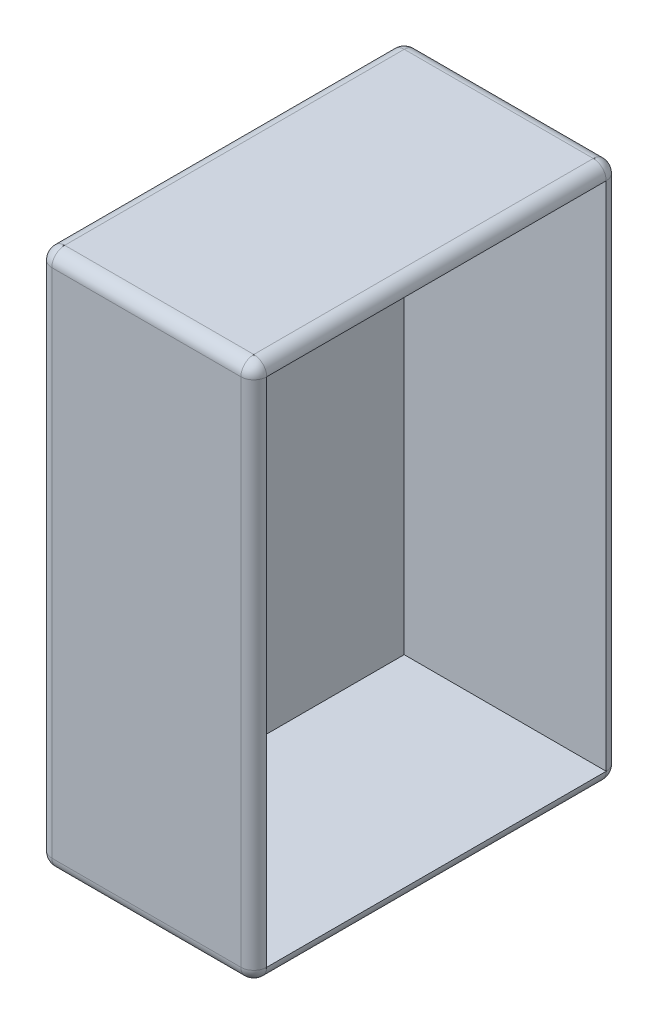
ISO-10303-21;
HEADER;
FILE_DESCRIPTION(('STEP AP214'),'2;1');
FILE_NAME('part.step','',(''),(''),'','','');
FILE_SCHEMA(('AUTOMOTIVE_DESIGN { 1 0 10303 214 1 1 1 1 }'));
ENDSEC;
DATA;
#1=APPLICATION_CONTEXT('core data for automotive mechanical design processes');
#2=APPLICATION_PROTOCOL_DEFINITION('international standard','automotive_design',2000,#1);
#3=PRODUCT_CONTEXT('',#1,'mechanical');
#4=PRODUCT('Part','Part','',(#3));
#5=PRODUCT_RELATED_PRODUCT_CATEGORY('part','',(#4));
#6=PRODUCT_DEFINITION_FORMATION('','',#4);
#7=PRODUCT_DEFINITION_CONTEXT('part definition',#1,'design');
#8=PRODUCT_DEFINITION('design','',#6,#7);
#9=PRODUCT_DEFINITION_SHAPE('','',#8);
#10=(LENGTH_UNIT() NAMED_UNIT(*) SI_UNIT(.MILLI.,.METRE.));
#11=(NAMED_UNIT(*) PLANE_ANGLE_UNIT() SI_UNIT($,.RADIAN.));
#12=(NAMED_UNIT(*) SI_UNIT($,.STERADIAN.) SOLID_ANGLE_UNIT());
#13=UNCERTAINTY_MEASURE_WITH_UNIT(LENGTH_MEASURE(1.E-05),#10,'distance_accuracy_value','');
#14=(GEOMETRIC_REPRESENTATION_CONTEXT(3) GLOBAL_UNCERTAINTY_ASSIGNED_CONTEXT((#13)) GLOBAL_UNIT_ASSIGNED_CONTEXT((#10,
#11,#12)) REPRESENTATION_CONTEXT('',''));
#15=CARTESIAN_POINT('',(0.,0.,0.));
#16=DIRECTION('',(0.,0.,1.));
#17=DIRECTION('',(1.,0.,0.));
#18=AXIS2_PLACEMENT_3D('',#15,#16,#17);
#19=CARTESIAN_POINT('',(-0.97,-0.595,0.03));
#20=DIRECTION('',(-1.,0.,0.));
#21=DIRECTION('',(0.,0.,1.));
#22=AXIS2_PLACEMENT_3D('',#19,#20,#21);
#23=PLANE('',#22);
#24=DIRECTION('',(0.,1.,0.));
#25=VECTOR('',#24,1.);
#26=CARTESIAN_POINT('',(-0.97,0.595,0.82));
#27=LINE('',#26,#25);
#28=CARTESIAN_POINT('',(-0.97,0.595,0.82));
#29=VERTEX_POINT('',#28);
#30=CARTESIAN_POINT('',(-0.97,-0.595,0.82));
#31=VERTEX_POINT('',#30);
#32=EDGE_CURVE('E309',#29,#31,#27,.F.);
#33=ORIENTED_EDGE('',*,*,#32,.T.);
#34=DIRECTION('',(0.,0.,-1.));
#35=VECTOR('',#34,1.);
#36=CARTESIAN_POINT('',(-0.97,-0.595,0.03));
#37=LINE('',#36,#35);
#38=CARTESIAN_POINT('',(-0.97,-0.595,0.03));
#39=VERTEX_POINT('',#38);
#40=EDGE_CURVE('E325',#31,#39,#37,.T.);
#41=ORIENTED_EDGE('',*,*,#40,.T.);
#42=DIRECTION('',(0.,1.,0.));
#43=VECTOR('',#42,1.);
#44=CARTESIAN_POINT('',(-0.97,0.595,0.03));
#45=LINE('',#44,#43);
#46=CARTESIAN_POINT('',(-0.97,0.595,0.03));
#47=VERTEX_POINT('',#46);
#48=EDGE_CURVE('E299',#47,#39,#45,.F.);
#49=ORIENTED_EDGE('',*,*,#48,.F.);
#50=DIRECTION('',(0.,0.,1.));
#51=VECTOR('',#50,1.);
#52=CARTESIAN_POINT('',(-0.97,0.595,0.03));
#53=LINE('',#52,#51);
#54=EDGE_CURVE('E308',#47,#29,#53,.T.);
#55=ORIENTED_EDGE('',*,*,#54,.T.);
#56=EDGE_LOOP('',(#33,#41,#49,#55));
#57=FACE_BOUND('',#56,.T.);
#58=ADVANCED_FACE('F17',(#57),#23,.F.);
#59=CARTESIAN_POINT('',(0.97,-0.595,0.03));
#60=DIRECTION('',(0.,-1.,0.));
#61=DIRECTION('',(0.,0.,-1.));
#62=AXIS2_PLACEMENT_3D('',#59,#60,#61);
#63=PLANE('',#62);
#64=DIRECTION('',(0.,0.,1.));
#65=VECTOR('',#64,1.);
#66=CARTESIAN_POINT('',(-0.5,-0.595,0.));
#67=LINE('',#66,#65);
#68=CARTESIAN_POINT('',(-0.5,-0.595,0.03));
#69=VERTEX_POINT('',#68);
#70=CARTESIAN_POINT('',(-0.5,-0.595,0.82));
#71=VERTEX_POINT('',#70);
#72=EDGE_CURVE('E235',#69,#71,#67,.T.);
#73=ORIENTED_EDGE('',*,*,#72,.F.);
#74=DIRECTION('',(1.,0.,0.));
#75=VECTOR('',#74,1.);
#76=CARTESIAN_POINT('',(-0.97,-0.595,0.03));
#77=LINE('',#76,#75);
#78=EDGE_CURVE('E343',#39,#69,#77,.T.);
#79=ORIENTED_EDGE('',*,*,#78,.F.);
#80=ORIENTED_EDGE('',*,*,#40,.F.);
#81=DIRECTION('',(1.,0.,0.));
#82=VECTOR('',#81,1.);
#83=CARTESIAN_POINT('',(-0.97,-0.595,0.82));
#84=LINE('',#83,#82);
#85=EDGE_CURVE('E306',#31,#71,#84,.T.);
#86=ORIENTED_EDGE('',*,*,#85,.T.);
#87=EDGE_LOOP('',(#73,#79,#80,#86));
#88=FACE_BOUND('',#87,.T.);
#89=ADVANCED_FACE('F340',(#88),#63,.F.);
#90=CARTESIAN_POINT('',(-0.97,0.595,0.82));
#91=DIRECTION('',(0.,0.,1.));
#92=DIRECTION('',(1.,0.,0.));
#93=AXIS2_PLACEMENT_3D('',#90,#91,#92);
#94=PLANE('',#93);
#95=ORIENTED_EDGE('',*,*,#32,.F.);
#96=DIRECTION('',(1.,0.,0.));
#97=VECTOR('',#96,1.);
#98=CARTESIAN_POINT('',(-0.97,0.595,0.82));
#99=LINE('',#98,#97);
#100=CARTESIAN_POINT('',(-0.5,0.595,0.82));
#101=VERTEX_POINT('',#100);
#102=EDGE_CURVE('E317',#29,#101,#99,.T.);
#103=ORIENTED_EDGE('',*,*,#102,.T.);
#104=DIRECTION('',(0.,1.,0.));
#105=VECTOR('',#104,1.);
#106=CARTESIAN_POINT('',(-0.5,-0.625,0.82));
#107=LINE('',#106,#105);
#108=EDGE_CURVE('E229',#71,#101,#107,.T.);
#109=ORIENTED_EDGE('',*,*,#108,.F.);
#110=ORIENTED_EDGE('',*,*,#85,.F.);
#111=EDGE_LOOP('',(#95,#103,#109,#110));
#112=FACE_BOUND('',#111,.T.);
#113=ADVANCED_FACE('F345',(#112),#94,.F.);
#114=CARTESIAN_POINT('',(-0.53,-0.595,0.819999999999999));
#115=DIRECTION('',(1.,0.,0.));
#116=DIRECTION('',(0.,0.,1.));
#117=AXIS2_PLACEMENT_3D('',#114,#115,#116);
#118=SPHERICAL_SURFACE('',#117,0.0300000000000009);
#119=CARTESIAN_POINT('',(-0.53,-0.595,0.82));
#120=DIRECTION('',(-1.,0.,0.));
#121=DIRECTION('',(0.,0.,1.));
#122=AXIS2_PLACEMENT_3D('',#119,#120,#121);
#123=CIRCLE('',#122,0.03);
#124=CARTESIAN_POINT('',(-0.53,-0.625,0.82));
#125=VERTEX_POINT('',#124);
#126=CARTESIAN_POINT('',(-0.53,-0.595,0.85));
#127=VERTEX_POINT('',#126);
#128=EDGE_CURVE('E189',#125,#127,#123,.T.);
#129=ORIENTED_EDGE('',*,*,#128,.F.);
#130=CARTESIAN_POINT('',(-0.53,-0.595,0.82));
#131=DIRECTION('',(0.,0.,1.));
#132=DIRECTION('',(1.,0.,0.));
#133=AXIS2_PLACEMENT_3D('',#130,#131,#132);
#134=CIRCLE('',#133,0.03);
#135=EDGE_CURVE('E254',#71,#125,#134,.F.);
#136=ORIENTED_EDGE('',*,*,#135,.F.);
#137=CARTESIAN_POINT('',(-0.53,-0.595,0.82));
#138=DIRECTION('',(0.,1.,0.));
#139=DIRECTION('',(0.,0.,1.));
#140=AXIS2_PLACEMENT_3D('',#137,#138,#139);
#141=CIRCLE('',#140,0.03);
#142=EDGE_CURVE('E232',#127,#71,#141,.T.);
#143=ORIENTED_EDGE('',*,*,#142,.F.);
#144=EDGE_LOOP('',(#129,#136,#143));
#145=FACE_BOUND('',#144,.T.);
#146=ADVANCED_FACE('F283',(#145),#118,.T.);
#147=CARTESIAN_POINT('',(-0.53,0.595,0.82));
#148=DIRECTION('',(0.,1.,0.));
#149=DIRECTION('',(0.,0.,1.));
#150=AXIS2_PLACEMENT_3D('',#147,#148,#149);
#151=SPHERICAL_SURFACE('',#150,0.0299999999999994);
#152=CARTESIAN_POINT('',(-0.53,0.595,0.82));
#153=DIRECTION('',(0.,1.,0.));
#154=DIRECTION('',(0.,0.,1.));
#155=AXIS2_PLACEMENT_3D('',#152,#153,#154);
#156=CIRCLE('',#155,0.03);
#157=CARTESIAN_POINT('',(-0.53,0.595000000000012,0.85));
#158=VERTEX_POINT('',#157);
#159=EDGE_CURVE('E226',#101,#158,#156,.F.);
#160=ORIENTED_EDGE('',*,*,#159,.F.);
#161=CARTESIAN_POINT('',(-0.53,0.595,0.82));
#162=DIRECTION('',(0.,0.,1.));
#163=DIRECTION('',(1.,0.,0.));
#164=AXIS2_PLACEMENT_3D('',#161,#162,#163);
#165=CIRCLE('',#164,0.03);
#166=CARTESIAN_POINT('',(-0.53,0.625,0.82));
#167=VERTEX_POINT('',#166);
#168=EDGE_CURVE('E176',#167,#101,#165,.F.);
#169=ORIENTED_EDGE('',*,*,#168,.F.);
#170=CARTESIAN_POINT('',(-0.53,0.595,0.82));
#171=DIRECTION('',(1.,0.,0.));
#172=DIRECTION('',(0.,0.,-1.));
#173=AXIS2_PLACEMENT_3D('',#170,#171,#172);
#174=CIRCLE('',#173,0.03);
#175=EDGE_CURVE('E179',#158,#167,#174,.F.);
#176=ORIENTED_EDGE('',*,*,#175,.F.);
#177=EDGE_LOOP('',(#160,#169,#176));
#178=FACE_BOUND('',#177,.T.);
#179=ADVANCED_FACE('F278',(#178),#151,.T.);
#180=CARTESIAN_POINT('',(-0.97,0.595,0.03));
#181=DIRECTION('',(0.,1.,0.));
#182=DIRECTION('',(0.,0.,1.));
#183=AXIS2_PLACEMENT_3D('',#180,#181,#182);
#184=PLANE('',#183);
#185=ORIENTED_EDGE('',*,*,#54,.F.);
#186=DIRECTION('',(1.,0.,0.));
#187=VECTOR('',#186,1.);
#188=CARTESIAN_POINT('',(-0.97,0.595,0.03));
#189=LINE('',#188,#187);
#190=CARTESIAN_POINT('',(-0.5,0.595000000000051,0.03));
#191=VERTEX_POINT('',#190);
#192=EDGE_CURVE('E322',#191,#47,#189,.F.);
#193=ORIENTED_EDGE('',*,*,#192,.F.);
#194=DIRECTION('',(0.,0.,1.));
#195=VECTOR('',#194,1.);
#196=CARTESIAN_POINT('',(-0.5,0.595,0.));
#197=LINE('',#196,#195);
#198=EDGE_CURVE('E173',#101,#191,#197,.F.);
#199=ORIENTED_EDGE('',*,*,#198,.F.);
#200=ORIENTED_EDGE('',*,*,#102,.F.);
#201=EDGE_LOOP('',(#185,#193,#199,#200));
#202=FACE_BOUND('',#201,.T.);
#203=ADVANCED_FACE('F274',(#202),#184,.F.);
#204=CARTESIAN_POINT('',(-0.97,0.595,0.03));
#205=DIRECTION('',(0.,0.,1.));
#206=DIRECTION('',(1.,0.,0.));
#207=AXIS2_PLACEMENT_3D('',#204,#205,#206);
#208=PLANE('',#207);
#209=ORIENTED_EDGE('',*,*,#192,.T.);
#210=ORIENTED_EDGE('',*,*,#48,.T.);
#211=ORIENTED_EDGE('',*,*,#78,.T.);
#212=DIRECTION('',(0.,1.,0.));
#213=VECTOR('',#212,1.);
#214=CARTESIAN_POINT('',(-0.5,-0.625,0.03));
#215=LINE('',#214,#213);
#216=EDGE_CURVE('E125',#191,#69,#215,.F.);
#217=ORIENTED_EDGE('',*,*,#216,.F.);
#218=EDGE_LOOP('',(#209,#210,#211,#217));
#219=FACE_BOUND('',#218,.T.);
#220=ADVANCED_FACE('F270',(#219),#208,.T.);
#221=CARTESIAN_POINT('',(-0.53,-0.595,0.0299999999999998));
#222=DIRECTION('',(1.,0.,0.));
#223=DIRECTION('',(0.,-1.,0.));
#224=AXIS2_PLACEMENT_3D('',#221,#222,#223);
#225=SPHERICAL_SURFACE('',#224,0.0299999999999998);
#226=CARTESIAN_POINT('',(-0.53,-0.595,0.03));
#227=DIRECTION('',(-1.,0.,0.));
#228=DIRECTION('',(0.,0.,1.));
#229=AXIS2_PLACEMENT_3D('',#226,#227,#228);
#230=CIRCLE('',#229,0.03);
#231=CARTESIAN_POINT('',(-0.53,-0.595,0.));
#232=VERTEX_POINT('',#231);
#233=CARTESIAN_POINT('',(-0.53,-0.625,0.03));
#234=VERTEX_POINT('',#233);
#235=EDGE_CURVE('E126',#232,#234,#230,.T.);
#236=ORIENTED_EDGE('',*,*,#235,.F.);
#237=CARTESIAN_POINT('',(-0.53,-0.595,0.03));
#238=DIRECTION('',(0.,1.,0.));
#239=DIRECTION('',(0.,0.,1.));
#240=AXIS2_PLACEMENT_3D('',#237,#238,#239);
#241=CIRCLE('',#240,0.03);
#242=EDGE_CURVE('E133',#69,#232,#241,.T.);
#243=ORIENTED_EDGE('',*,*,#242,.F.);
#244=CARTESIAN_POINT('',(-0.53,-0.595,0.03));
#245=DIRECTION('',(0.,0.,1.));
#246=DIRECTION('',(1.,0.,0.));
#247=AXIS2_PLACEMENT_3D('',#244,#245,#246);
#248=CIRCLE('',#247,0.03);
#249=EDGE_CURVE('E251',#234,#69,#248,.T.);
#250=ORIENTED_EDGE('',*,*,#249,.F.);
#251=EDGE_LOOP('',(#236,#243,#250));
#252=FACE_BOUND('',#251,.T.);
#253=ADVANCED_FACE('F266',(#252),#225,.T.);
#254=CARTESIAN_POINT('',(-0.53,0.595,0.03));
#255=DIRECTION('',(0.,1.,0.));
#256=DIRECTION('',(0.,0.,1.));
#257=AXIS2_PLACEMENT_3D('',#254,#255,#256);
#258=SPHERICAL_SURFACE('',#257,0.03);
#259=CARTESIAN_POINT('',(-0.53,0.595,0.03));
#260=DIRECTION('',(0.,0.,1.));
#261=DIRECTION('',(1.,0.,0.));
#262=AXIS2_PLACEMENT_3D('',#259,#260,#261);
#263=CIRCLE('',#262,0.03);
#264=CARTESIAN_POINT('',(-0.53,0.625,0.03));
#265=VERTEX_POINT('',#264);
#266=EDGE_CURVE('E122',#191,#265,#263,.T.);
#267=ORIENTED_EDGE('',*,*,#266,.F.);
#268=CARTESIAN_POINT('',(-0.53,0.595000000000128,0.03));
#269=DIRECTION('',(0.,1.,0.));
#270=DIRECTION('',(0.,0.,1.));
#271=AXIS2_PLACEMENT_3D('',#268,#269,#270);
#272=CIRCLE('',#271,0.03);
#273=CARTESIAN_POINT('',(-0.53,0.595000000000064,0.));
#274=VERTEX_POINT('',#273);
#275=EDGE_CURVE('E116',#274,#191,#272,.F.);
#276=ORIENTED_EDGE('',*,*,#275,.F.);
#277=CARTESIAN_POINT('',(-0.53,0.595,0.03));
#278=DIRECTION('',(1.,0.,0.));
#279=DIRECTION('',(0.,0.,-1.));
#280=AXIS2_PLACEMENT_3D('',#277,#278,#279);
#281=CIRCLE('',#280,0.03);
#282=EDGE_CURVE('E120',#265,#274,#281,.F.);
#283=ORIENTED_EDGE('',*,*,#282,.F.);
#284=EDGE_LOOP('',(#267,#276,#283));
#285=FACE_BOUND('',#284,.T.);
#286=ADVANCED_FACE('F118',(#285),#258,.T.);
#287=CARTESIAN_POINT('',(-0.53,-0.595,0.));
#288=DIRECTION('',(0.,0.,1.));
#289=DIRECTION('',(1.,0.,0.));
#290=AXIS2_PLACEMENT_3D('',#287,#288,#289);
#291=CYLINDRICAL_SURFACE('',#290,0.03);
#292=ORIENTED_EDGE('',*,*,#249,.T.);
#293=ORIENTED_EDGE('',*,*,#72,.T.);
#294=ORIENTED_EDGE('',*,*,#135,.T.);
#295=DIRECTION('',(0.,0.,-1.));
#296=VECTOR('',#295,1.);
#297=CARTESIAN_POINT('',(-0.53,-0.625,0.));
#298=LINE('',#297,#296);
#299=EDGE_CURVE('E223',#234,#125,#298,.F.);
#300=ORIENTED_EDGE('',*,*,#299,.F.);
#301=EDGE_LOOP('',(#292,#293,#294,#300));
#302=FACE_BOUND('',#301,.T.);
#303=ADVANCED_FACE('F265',(#302),#291,.T.);
#304=CARTESIAN_POINT('',(-0.53,-0.625,0.82));
#305=DIRECTION('',(0.,1.,0.));
#306=DIRECTION('',(0.,0.,1.));
#307=AXIS2_PLACEMENT_3D('',#304,#305,#306);
#308=CYLINDRICAL_SURFACE('',#307,0.03);
#309=ORIENTED_EDGE('',*,*,#108,.T.);
#310=ORIENTED_EDGE('',*,*,#159,.T.);
#311=DIRECTION('',(0.,1.,0.));
#312=VECTOR('',#311,1.);
#313=CARTESIAN_POINT('',(-0.53,-0.625,0.85));
#314=LINE('',#313,#312);
#315=EDGE_CURVE('E208',#127,#158,#314,.T.);
#316=ORIENTED_EDGE('',*,*,#315,.F.);
#317=ORIENTED_EDGE('',*,*,#142,.T.);
#318=EDGE_LOOP('',(#309,#310,#316,#317));
#319=FACE_BOUND('',#318,.T.);
#320=ADVANCED_FACE('F482',(#319),#308,.T.);
#321=CARTESIAN_POINT('',(-0.5,-0.595,0.82));
#322=DIRECTION('',(-1.,0.,0.));
#323=DIRECTION('',(0.,0.,1.));
#324=AXIS2_PLACEMENT_3D('',#321,#322,#323);
#325=CYLINDRICAL_SURFACE('',#324,0.03);
#326=ORIENTED_EDGE('',*,*,#128,.T.);
#327=DIRECTION('',(1.,0.,0.));
#328=VECTOR('',#327,1.);
#329=CARTESIAN_POINT('',(-0.5,-0.595,0.85));
#330=LINE('',#329,#328);
#331=CARTESIAN_POINT('',(-0.97,-0.595,0.85));
#332=VERTEX_POINT('',#331);
#333=EDGE_CURVE('E207',#332,#127,#330,.T.);
#334=ORIENTED_EDGE('',*,*,#333,.F.);
#335=CARTESIAN_POINT('',(-0.97,-0.595,0.82));
#336=DIRECTION('',(1.,0.,0.));
#337=DIRECTION('',(0.,1.,0.));
#338=AXIS2_PLACEMENT_3D('',#335,#336,#337);
#339=CIRCLE('',#338,0.0300000000000002);
#340=CARTESIAN_POINT('',(-0.970000000000004,-0.625,0.819999999999968));
#341=VERTEX_POINT('',#340);
#342=EDGE_CURVE('E194',#341,#332,#339,.F.);
#343=ORIENTED_EDGE('',*,*,#342,.F.);
#344=DIRECTION('',(1.,0.,0.));
#345=VECTOR('',#344,1.);
#346=CARTESIAN_POINT('',(-0.5,-0.625,0.82));
#347=LINE('',#346,#345);
#348=EDGE_CURVE('E146',#125,#341,#347,.F.);
#349=ORIENTED_EDGE('',*,*,#348,.F.);
#350=EDGE_LOOP('',(#326,#334,#343,#349));
#351=FACE_BOUND('',#350,.T.);
#352=ADVANCED_FACE('F484',(#351),#325,.T.);
#353=CARTESIAN_POINT('',(-1.,0.595,0.82));
#354=DIRECTION('',(1.,0.,0.));
#355=DIRECTION('',(0.,0.,-1.));
#356=AXIS2_PLACEMENT_3D('',#353,#354,#355);
#357=CYLINDRICAL_SURFACE('',#356,0.03);
#358=CARTESIAN_POINT('',(-0.97,0.595,0.82));
#359=DIRECTION('',(1.,0.,0.));
#360=DIRECTION('',(0.,1.,0.));
#361=AXIS2_PLACEMENT_3D('',#358,#359,#360);
#362=CIRCLE('',#361,0.0299999999999998);
#363=CARTESIAN_POINT('',(-0.97,0.595000000000012,0.85));
#364=VERTEX_POINT('',#363);
#365=CARTESIAN_POINT('',(-0.97,0.625,0.82));
#366=VERTEX_POINT('',#365);
#367=EDGE_CURVE('E184',#364,#366,#362,.F.);
#368=ORIENTED_EDGE('',*,*,#367,.F.);
#369=DIRECTION('',(1.,0.,0.));
#370=VECTOR('',#369,1.);
#371=CARTESIAN_POINT('',(-0.5,0.595,0.85));
#372=LINE('',#371,#370);
#373=EDGE_CURVE('E204',#158,#364,#372,.F.);
#374=ORIENTED_EDGE('',*,*,#373,.F.);
#375=ORIENTED_EDGE('',*,*,#175,.T.);
#376=DIRECTION('',(1.,0.,0.));
#377=VECTOR('',#376,1.);
#378=CARTESIAN_POINT('',(-1.,0.625,0.82));
#379=LINE('',#378,#377);
#380=EDGE_CURVE('E169',#366,#167,#379,.T.);
#381=ORIENTED_EDGE('',*,*,#380,.F.);
#382=EDGE_LOOP('',(#368,#374,#375,#381));
#383=FACE_BOUND('',#382,.T.);
#384=ADVANCED_FACE('F477',(#383),#357,.T.);
#385=CARTESIAN_POINT('',(-0.53,0.595,0.));
#386=DIRECTION('',(0.,0.,1.));
#387=DIRECTION('',(1.,0.,0.));
#388=AXIS2_PLACEMENT_3D('',#385,#386,#387);
#389=CYLINDRICAL_SURFACE('',#388,0.03);
#390=ORIENTED_EDGE('',*,*,#198,.T.);
#391=ORIENTED_EDGE('',*,*,#266,.T.);
#392=DIRECTION('',(0.,0.,1.));
#393=VECTOR('',#392,1.);
#394=CARTESIAN_POINT('',(-0.53,0.625,0.));
#395=LINE('',#394,#393);
#396=EDGE_CURVE('E167',#167,#265,#395,.F.);
#397=ORIENTED_EDGE('',*,*,#396,.F.);
#398=ORIENTED_EDGE('',*,*,#168,.T.);
#399=EDGE_LOOP('',(#390,#391,#397,#398));
#400=FACE_BOUND('',#399,.T.);
#401=ADVANCED_FACE('F473',(#400),#389,.T.);
#402=CARTESIAN_POINT('',(-0.5,-0.595,0.03));
#403=DIRECTION('',(-1.,0.,0.));
#404=DIRECTION('',(0.,0.,1.));
#405=AXIS2_PLACEMENT_3D('',#402,#403,#404);
#406=CYLINDRICAL_SURFACE('',#405,0.03);
#407=DIRECTION('',(1.,0.,0.));
#408=VECTOR('',#407,1.);
#409=CARTESIAN_POINT('',(-0.5,-0.625,0.03));
#410=LINE('',#409,#408);
#411=CARTESIAN_POINT('',(-0.970000000000008,-0.625,0.0300000000000001));
#412=VERTEX_POINT('',#411);
#413=EDGE_CURVE('E248',#412,#234,#410,.T.);
#414=ORIENTED_EDGE('',*,*,#413,.F.);
#415=CARTESIAN_POINT('',(-0.97,-0.595,0.0300000000000001));
#416=DIRECTION('',(1.,0.,0.));
#417=DIRECTION('',(0.,-1.,0.));
#418=AXIS2_PLACEMENT_3D('',#415,#416,#417);
#419=CIRCLE('',#418,0.0300000000000001);
#420=CARTESIAN_POINT('',(-0.970000000000036,-0.595000000000048,0.));
#421=VERTEX_POINT('',#420);
#422=EDGE_CURVE('E369',#421,#412,#419,.F.);
#423=ORIENTED_EDGE('',*,*,#422,.F.);
#424=DIRECTION('',(1.,0.,0.));
#425=VECTOR('',#424,1.);
#426=CARTESIAN_POINT('',(-0.5,-0.595,0.));
#427=LINE('',#426,#425);
#428=EDGE_CURVE('E137',#421,#232,#427,.T.);
#429=ORIENTED_EDGE('',*,*,#428,.T.);
#430=ORIENTED_EDGE('',*,*,#235,.T.);
#431=EDGE_LOOP('',(#414,#423,#429,#430));
#432=FACE_BOUND('',#431,.T.);
#433=ADVANCED_FACE('F354',(#432),#406,.T.);
#434=CARTESIAN_POINT('',(-0.53,-0.625,0.03));
#435=DIRECTION('',(0.,1.,0.));
#436=DIRECTION('',(0.,0.,1.));
#437=AXIS2_PLACEMENT_3D('',#434,#435,#436);
#438=CYLINDRICAL_SURFACE('',#437,0.03);
#439=ORIENTED_EDGE('',*,*,#216,.T.);
#440=ORIENTED_EDGE('',*,*,#242,.T.);
#441=DIRECTION('',(0.,1.,0.));
#442=VECTOR('',#441,1.);
#443=CARTESIAN_POINT('',(-0.53,-0.625,0.));
#444=LINE('',#443,#442);
#445=EDGE_CURVE('E130',#232,#274,#444,.T.);
#446=ORIENTED_EDGE('',*,*,#445,.T.);
#447=ORIENTED_EDGE('',*,*,#275,.T.);
#448=EDGE_LOOP('',(#439,#440,#446,#447));
#449=FACE_BOUND('',#448,.T.);
#450=ADVANCED_FACE('F131',(#449),#438,.T.);
#451=CARTESIAN_POINT('',(-1.,0.595,0.03));
#452=DIRECTION('',(1.,0.,0.));
#453=DIRECTION('',(0.,0.,-1.));
#454=AXIS2_PLACEMENT_3D('',#451,#452,#453);
#455=CYLINDRICAL_SURFACE('',#454,0.03);
#456=DIRECTION('',(1.,0.,0.));
#457=VECTOR('',#456,1.);
#458=CARTESIAN_POINT('',(-1.,0.625,0.03));
#459=LINE('',#458,#457);
#460=CARTESIAN_POINT('',(-0.97,0.625,0.0299999999998543));
#461=VERTEX_POINT('',#460);
#462=EDGE_CURVE('E144',#265,#461,#459,.F.);
#463=ORIENTED_EDGE('',*,*,#462,.F.);
#464=ORIENTED_EDGE('',*,*,#282,.T.);
#465=DIRECTION('',(1.,0.,0.));
#466=VECTOR('',#465,1.);
#467=CARTESIAN_POINT('',(-0.5,0.595000000000128,0.));
#468=LINE('',#467,#466);
#469=CARTESIAN_POINT('',(-0.970000000000031,0.595000000000064,0.));
#470=VERTEX_POINT('',#469);
#471=EDGE_CURVE('E20',#274,#470,#468,.F.);
#472=ORIENTED_EDGE('',*,*,#471,.T.);
#473=CARTESIAN_POINT('',(-0.969999999999999,0.594999999999999,0.0300000000000005));
#474=DIRECTION('',(1.,0.,0.));
#475=DIRECTION('',(0.,0.,-1.));
#476=AXIS2_PLACEMENT_3D('',#473,#474,#475);
#477=CIRCLE('',#476,0.0300000000000013);
#478=EDGE_CURVE('E371',#461,#470,#477,.F.);
#479=ORIENTED_EDGE('',*,*,#478,.F.);
#480=EDGE_LOOP('',(#463,#464,#472,#479));
#481=FACE_BOUND('',#480,.T.);
#482=ADVANCED_FACE('F142',(#481),#455,.T.);
#483=CARTESIAN_POINT('',(-0.5,-0.625,0.));
#484=DIRECTION('',(0.,-1.,0.));
#485=DIRECTION('',(0.,0.,-1.));
#486=AXIS2_PLACEMENT_3D('',#483,#484,#485);
#487=PLANE('',#486);
#488=ORIENTED_EDGE('',*,*,#413,.T.);
#489=ORIENTED_EDGE('',*,*,#299,.T.);
#490=ORIENTED_EDGE('',*,*,#348,.T.);
#491=DIRECTION('',(0.,0.,1.));
#492=VECTOR('',#491,1.);
#493=CARTESIAN_POINT('',(-0.970000000000032,-0.625,0.));
#494=LINE('',#493,#492);
#495=EDGE_CURVE('E154',#412,#341,#494,.T.);
#496=ORIENTED_EDGE('',*,*,#495,.F.);
#497=EDGE_LOOP('',(#488,#489,#490,#496));
#498=FACE_BOUND('',#497,.T.);
#499=ADVANCED_FACE('F387',(#498),#487,.T.);
#500=CARTESIAN_POINT('',(-0.5,-0.625,0.85));
#501=DIRECTION('',(0.,0.,1.));
#502=DIRECTION('',(1.,0.,0.));
#503=AXIS2_PLACEMENT_3D('',#500,#501,#502);
#504=PLANE('',#503);
#505=DIRECTION('',(0.,1.,0.));
#506=VECTOR('',#505,1.);
#507=CARTESIAN_POINT('',(-0.97,-0.625,0.85));
#508=LINE('',#507,#506);
#509=EDGE_CURVE('E214',#332,#364,#508,.T.);
#510=ORIENTED_EDGE('',*,*,#509,.F.);
#511=ORIENTED_EDGE('',*,*,#333,.T.);
#512=ORIENTED_EDGE('',*,*,#315,.T.);
#513=ORIENTED_EDGE('',*,*,#373,.T.);
#514=EDGE_LOOP('',(#510,#511,#512,#513));
#515=FACE_BOUND('',#514,.T.);
#516=ADVANCED_FACE('F481',(#515),#504,.T.);
#517=CARTESIAN_POINT('',(-0.97,-0.595,0.82));
#518=DIRECTION('',(1.,0.,0.));
#519=DIRECTION('',(0.,1.,0.));
#520=AXIS2_PLACEMENT_3D('',#517,#518,#519);
#521=SPHERICAL_SURFACE('',#520,0.0300000000000002);
#522=ORIENTED_EDGE('',*,*,#342,.T.);
#523=CARTESIAN_POINT('',(-0.97,-0.595,0.82));
#524=DIRECTION('',(0.,1.,0.));
#525=DIRECTION('',(0.,0.,1.));
#526=AXIS2_PLACEMENT_3D('',#523,#524,#525);
#527=CIRCLE('',#526,0.03);
#528=CARTESIAN_POINT('',(-1.,-0.595,0.82));
#529=VERTEX_POINT('',#528);
#530=EDGE_CURVE('E201',#529,#332,#527,.T.);
#531=ORIENTED_EDGE('',*,*,#530,.F.);
#532=CARTESIAN_POINT('',(-0.97,-0.595,0.82));
#533=DIRECTION('',(0.,0.,1.));
#534=DIRECTION('',(1.,0.,0.));
#535=AXIS2_PLACEMENT_3D('',#532,#533,#534);
#536=CIRCLE('',#535,0.03);
#537=EDGE_CURVE('E159',#341,#529,#536,.F.);
#538=ORIENTED_EDGE('',*,*,#537,.F.);
#539=EDGE_LOOP('',(#522,#531,#538));
#540=FACE_BOUND('',#539,.T.);
#541=ADVANCED_FACE('F436',(#540),#521,.T.);
#542=CARTESIAN_POINT('',(-0.97,0.595,0.82));
#543=DIRECTION('',(0.,1.,0.));
#544=DIRECTION('',(0.,0.,-1.));
#545=AXIS2_PLACEMENT_3D('',#542,#543,#544);
#546=SPHERICAL_SURFACE('',#545,0.0299999999999998);
#547=CARTESIAN_POINT('',(-0.97,0.595,0.82));
#548=DIRECTION('',(0.,0.,1.));
#549=DIRECTION('',(1.,0.,0.));
#550=AXIS2_PLACEMENT_3D('',#547,#548,#549);
#551=CIRCLE('',#550,0.03);
#552=CARTESIAN_POINT('',(-1.,0.595000000000008,0.820000000000128));
#553=VERTEX_POINT('',#552);
#554=EDGE_CURVE('E197',#553,#366,#551,.F.);
#555=ORIENTED_EDGE('',*,*,#554,.F.);
#556=CARTESIAN_POINT('',(-0.97,0.595000000000032,0.82));
#557=DIRECTION('',(0.,1.,0.));
#558=DIRECTION('',(0.,0.,1.));
#559=AXIS2_PLACEMENT_3D('',#556,#557,#558);
#560=CIRCLE('',#559,0.03);
#561=EDGE_CURVE('E211',#364,#553,#560,.F.);
#562=ORIENTED_EDGE('',*,*,#561,.F.);
#563=ORIENTED_EDGE('',*,*,#367,.T.);
#564=EDGE_LOOP('',(#555,#562,#563));
#565=FACE_BOUND('',#564,.T.);
#566=ADVANCED_FACE('F432',(#565),#546,.T.);
#567=CARTESIAN_POINT('',(-1.,0.625,0.));
#568=DIRECTION('',(0.,1.,0.));
#569=DIRECTION('',(0.,0.,1.));
#570=AXIS2_PLACEMENT_3D('',#567,#568,#569);
#571=PLANE('',#570);
#572=ORIENTED_EDGE('',*,*,#396,.T.);
#573=ORIENTED_EDGE('',*,*,#462,.T.);
#574=DIRECTION('',(0.,0.,1.));
#575=VECTOR('',#574,1.);
#576=CARTESIAN_POINT('',(-0.97,0.625,0.));
#577=LINE('',#576,#575);
#578=EDGE_CURVE('E200',#366,#461,#577,.F.);
#579=ORIENTED_EDGE('',*,*,#578,.F.);
#580=ORIENTED_EDGE('',*,*,#380,.T.);
#581=EDGE_LOOP('',(#572,#573,#579,#580));
#582=FACE_BOUND('',#581,.T.);
#583=ADVANCED_FACE('F428',(#582),#571,.T.);
#584=CARTESIAN_POINT('',(-0.97,-0.595,0.0300000000000001));
#585=DIRECTION('',(1.,0.,0.));
#586=DIRECTION('',(0.,-1.,0.));
#587=AXIS2_PLACEMENT_3D('',#584,#585,#586);
#588=SPHERICAL_SURFACE('',#587,0.0300000000000001);
#589=CARTESIAN_POINT('',(-0.97,-0.595,0.03));
#590=DIRECTION('',(0.,1.,0.));
#591=DIRECTION('',(0.,0.,1.));
#592=AXIS2_PLACEMENT_3D('',#589,#590,#591);
#593=CIRCLE('',#592,0.03);
#594=CARTESIAN_POINT('',(-1.,-0.595,0.0299999999999998));
#595=VERTEX_POINT('',#594);
#596=EDGE_CURVE('E363',#421,#595,#593,.T.);
#597=ORIENTED_EDGE('',*,*,#596,.F.);
#598=ORIENTED_EDGE('',*,*,#422,.T.);
#599=CARTESIAN_POINT('',(-0.97,-0.595,0.03));
#600=DIRECTION('',(0.,0.,1.));
#601=DIRECTION('',(1.,0.,0.));
#602=AXIS2_PLACEMENT_3D('',#599,#600,#601);
#603=CIRCLE('',#602,0.03);
#604=EDGE_CURVE('E152',#595,#412,#603,.T.);
#605=ORIENTED_EDGE('',*,*,#604,.F.);
#606=EDGE_LOOP('',(#597,#598,#605));
#607=FACE_BOUND('',#606,.T.);
#608=ADVANCED_FACE('F424',(#607),#588,.T.);
#609=CARTESIAN_POINT('',(-0.969999999999999,0.594999999999999,0.0300000000000005));
#610=DIRECTION('',(1.,0.,0.));
#611=DIRECTION('',(0.,0.,-1.));
#612=AXIS2_PLACEMENT_3D('',#609,#610,#611);
#613=SPHERICAL_SURFACE('',#612,0.0300000000000013);
#614=CARTESIAN_POINT('',(-0.97,0.595,0.03));
#615=DIRECTION('',(0.,0.,1.));
#616=DIRECTION('',(1.,0.,0.));
#617=AXIS2_PLACEMENT_3D('',#614,#615,#616);
#618=CIRCLE('',#617,0.03);
#619=CARTESIAN_POINT('',(-1.,0.594999999999999,0.0300000000000003));
#620=VERTEX_POINT('',#619);
#621=EDGE_CURVE('E366',#461,#620,#618,.T.);
#622=ORIENTED_EDGE('',*,*,#621,.F.);
#623=ORIENTED_EDGE('',*,*,#478,.T.);
#624=CARTESIAN_POINT('',(-0.97,0.595,0.03));
#625=DIRECTION('',(0.,1.,0.));
#626=DIRECTION('',(0.,0.,1.));
#627=AXIS2_PLACEMENT_3D('',#624,#625,#626);
#628=CIRCLE('',#627,0.03);
#629=EDGE_CURVE('E35',#620,#470,#628,.F.);
#630=ORIENTED_EDGE('',*,*,#629,.F.);
#631=EDGE_LOOP('',(#622,#623,#630));
#632=FACE_BOUND('',#631,.T.);
#633=ADVANCED_FACE('F420',(#632),#613,.T.);
#634=CARTESIAN_POINT('',(-0.5,-0.625,0.));
#635=DIRECTION('',(0.,0.,1.));
#636=DIRECTION('',(1.,0.,0.));
#637=AXIS2_PLACEMENT_3D('',#634,#635,#636);
#638=PLANE('',#637);
#639=ORIENTED_EDGE('',*,*,#471,.F.);
#640=ORIENTED_EDGE('',*,*,#445,.F.);
#641=ORIENTED_EDGE('',*,*,#428,.F.);
#642=DIRECTION('',(0.,1.,0.));
#643=VECTOR('',#642,1.);
#644=CARTESIAN_POINT('',(-0.970000000000064,-0.625,0.));
#645=LINE('',#644,#643);
#646=EDGE_CURVE('E151',#470,#421,#645,.F.);
#647=ORIENTED_EDGE('',*,*,#646,.F.);
#648=EDGE_LOOP('',(#639,#640,#641,#647));
#649=FACE_BOUND('',#648,.T.);
#650=ADVANCED_FACE('F149',(#649),#638,.F.);
#651=CARTESIAN_POINT('',(-0.97,-0.595,0.));
#652=DIRECTION('',(0.,0.,1.));
#653=DIRECTION('',(1.,0.,0.));
#654=AXIS2_PLACEMENT_3D('',#651,#652,#653);
#655=CYLINDRICAL_SURFACE('',#654,0.03);
#656=ORIENTED_EDGE('',*,*,#495,.T.);
#657=ORIENTED_EDGE('',*,*,#537,.T.);
#658=DIRECTION('',(0.,0.,1.));
#659=VECTOR('',#658,1.);
#660=CARTESIAN_POINT('',(-1.,-0.595,0.));
#661=LINE('',#660,#659);
#662=EDGE_CURVE('E394',#595,#529,#661,.T.);
#663=ORIENTED_EDGE('',*,*,#662,.F.);
#664=ORIENTED_EDGE('',*,*,#604,.T.);
#665=EDGE_LOOP('',(#656,#657,#663,#664));
#666=FACE_BOUND('',#665,.T.);
#667=ADVANCED_FACE('F391',(#666),#655,.T.);
#668=CARTESIAN_POINT('',(-0.97,-0.625,0.82));
#669=DIRECTION('',(0.,1.,0.));
#670=DIRECTION('',(0.,0.,1.));
#671=AXIS2_PLACEMENT_3D('',#668,#669,#670);
#672=CYLINDRICAL_SURFACE('',#671,0.03);
#673=DIRECTION('',(0.,1.,0.));
#674=VECTOR('',#673,1.);
#675=CARTESIAN_POINT('',(-1.,-0.625,0.82));
#676=LINE('',#675,#674);
#677=EDGE_CURVE('E401',#529,#553,#676,.T.);
#678=ORIENTED_EDGE('',*,*,#677,.F.);
#679=ORIENTED_EDGE('',*,*,#530,.T.);
#680=ORIENTED_EDGE('',*,*,#509,.T.);
#681=ORIENTED_EDGE('',*,*,#561,.T.);
#682=EDGE_LOOP('',(#678,#679,#680,#681));
#683=FACE_BOUND('',#682,.T.);
#684=ADVANCED_FACE('F402',(#683),#672,.T.);
#685=CARTESIAN_POINT('',(-0.97,0.595,0.));
#686=DIRECTION('',(0.,0.,1.));
#687=DIRECTION('',(1.,0.,0.));
#688=AXIS2_PLACEMENT_3D('',#685,#686,#687);
#689=CYLINDRICAL_SURFACE('',#688,0.03);
#690=ORIENTED_EDGE('',*,*,#578,.T.);
#691=ORIENTED_EDGE('',*,*,#621,.T.);
#692=DIRECTION('',(0.,0.,1.));
#693=VECTOR('',#692,1.);
#694=CARTESIAN_POINT('',(-1.,0.595,0.));
#695=LINE('',#694,#693);
#696=EDGE_CURVE('E26',#553,#620,#695,.F.);
#697=ORIENTED_EDGE('',*,*,#696,.F.);
#698=ORIENTED_EDGE('',*,*,#554,.T.);
#699=EDGE_LOOP('',(#690,#691,#697,#698));
#700=FACE_BOUND('',#699,.T.);
#701=ADVANCED_FACE('F497',(#700),#689,.T.);
#702=CARTESIAN_POINT('',(-0.97,-0.625,0.03));
#703=DIRECTION('',(0.,1.,0.));
#704=DIRECTION('',(0.,0.,1.));
#705=AXIS2_PLACEMENT_3D('',#702,#703,#704);
#706=CYLINDRICAL_SURFACE('',#705,0.03);
#707=ORIENTED_EDGE('',*,*,#629,.T.);
#708=ORIENTED_EDGE('',*,*,#646,.T.);
#709=ORIENTED_EDGE('',*,*,#596,.T.);
#710=DIRECTION('',(0.,1.,0.));
#711=VECTOR('',#710,1.);
#712=CARTESIAN_POINT('',(-1.,-0.625,0.03));
#713=LINE('',#712,#711);
#714=EDGE_CURVE('E11',#620,#595,#713,.F.);
#715=ORIENTED_EDGE('',*,*,#714,.F.);
#716=EDGE_LOOP('',(#707,#708,#709,#715));
#717=FACE_BOUND('',#716,.T.);
#718=ADVANCED_FACE('F492',(#717),#706,.T.);
#719=CARTESIAN_POINT('',(-1.,-0.625,0.));
#720=DIRECTION('',(-1.,0.,0.));
#721=DIRECTION('',(0.,0.,1.));
#722=AXIS2_PLACEMENT_3D('',#719,#720,#721);
#723=PLANE('',#722);
#724=ORIENTED_EDGE('',*,*,#696,.T.);
#725=ORIENTED_EDGE('',*,*,#714,.T.);
#726=ORIENTED_EDGE('',*,*,#662,.T.);
#727=ORIENTED_EDGE('',*,*,#677,.T.);
#728=EDGE_LOOP('',(#724,#725,#726,#727));
#729=FACE_BOUND('',#728,.T.);
#730=ADVANCED_FACE('F408',(#729),#723,.T.);
#731=CLOSED_SHELL('',(#58,#89,#113,#146,#179,#203,#220,#253,#286,#303,#320,#352,#384,#401,#433,
#450,#482,#499,#516,#541,#566,#583,#608,#633,#650,#667,#684,#701,#718,#730));
#732=MANIFOLD_SOLID_BREP('B1',#731);
#733=ADVANCED_BREP_SHAPE_REPRESENTATION('',(#18,#732),#14);
#734=SHAPE_DEFINITION_REPRESENTATION(#9,#733);
ENDSEC;
END-ISO-10303-21;
